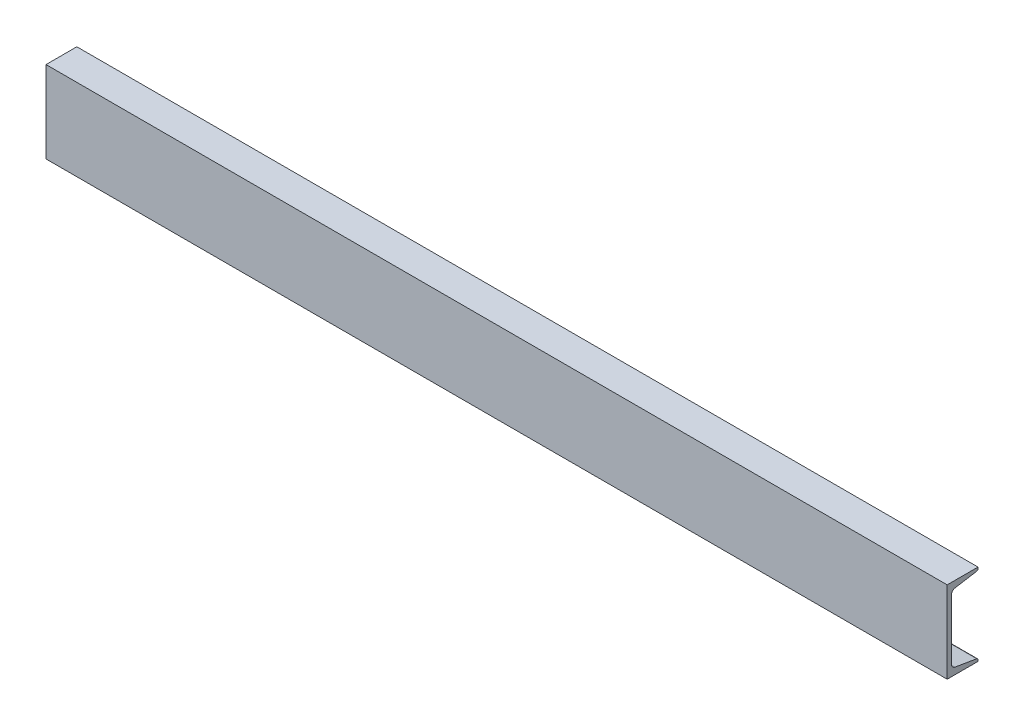
ISO-10303-21;
HEADER;
FILE_DESCRIPTION(('STEP AP214'),'2;1');
FILE_NAME('part.step','',(''),(''),'','','');
FILE_SCHEMA(('AUTOMOTIVE_DESIGN { 1 0 10303 214 1 1 1 1 }'));
ENDSEC;
DATA;
#1=APPLICATION_CONTEXT('core data for automotive mechanical design processes');
#2=APPLICATION_PROTOCOL_DEFINITION('international standard','automotive_design',2000,#1);
#3=PRODUCT_CONTEXT('',#1,'mechanical');
#4=PRODUCT('Part','Part','',(#3));
#5=PRODUCT_RELATED_PRODUCT_CATEGORY('part','',(#4));
#6=PRODUCT_DEFINITION_FORMATION('','',#4);
#7=PRODUCT_DEFINITION_CONTEXT('part definition',#1,'design');
#8=PRODUCT_DEFINITION('design','',#6,#7);
#9=PRODUCT_DEFINITION_SHAPE('','',#8);
#10=(LENGTH_UNIT() NAMED_UNIT(*) SI_UNIT(.MILLI.,.METRE.));
#11=(NAMED_UNIT(*) PLANE_ANGLE_UNIT() SI_UNIT($,.RADIAN.));
#12=(NAMED_UNIT(*) SI_UNIT($,.STERADIAN.) SOLID_ANGLE_UNIT());
#13=UNCERTAINTY_MEASURE_WITH_UNIT(LENGTH_MEASURE(1.E-05),#10,'distance_accuracy_value','');
#14=(GEOMETRIC_REPRESENTATION_CONTEXT(3) GLOBAL_UNCERTAINTY_ASSIGNED_CONTEXT((#13)) GLOBAL_UNIT_ASSIGNED_CONTEXT((#10,
#11,#12)) REPRESENTATION_CONTEXT('',''));
#15=CARTESIAN_POINT('',(0.,0.,0.));
#16=DIRECTION('',(0.,0.,1.));
#17=DIRECTION('',(1.,0.,0.));
#18=AXIS2_PLACEMENT_3D('',#15,#16,#17);
#19=CARTESIAN_POINT('',(1400.00000000001,-63.4999999999621,3.5527136788005E-12));
#20=DIRECTION('',(0.,1.,0.));
#21=DIRECTION('',(0.,0.,1.));
#22=AXIS2_PLACEMENT_3D('',#19,#20,#21);
#23=PLANE('',#22);
#24=DIRECTION('',(0.,0.,-1.));
#25=VECTOR('',#24,1.);
#26=CARTESIAN_POINT('',(0.,-63.5000000000048,0.));
#27=LINE('',#26,#25);
#28=CARTESIAN_POINT('',(0.,-63.5000000000048,0.));
#29=VERTEX_POINT('',#28);
#30=CARTESIAN_POINT('',(0.,-63.5000000000048,-47.8999999999985));
#31=VERTEX_POINT('',#30);
#32=EDGE_CURVE('E194',#29,#31,#27,.T.);
#33=ORIENTED_EDGE('',*,*,#32,.T.);
#34=DIRECTION('',(-1.,0.,0.));
#35=VECTOR('',#34,1.);
#36=CARTESIAN_POINT('',(1400.00000000001,-63.4999999999621,-47.8999999999985));
#37=LINE('',#36,#35);
#38=CARTESIAN_POINT('',(1400.00000000001,-63.4999999999621,-47.8999999999985));
#39=VERTEX_POINT('',#38);
#40=EDGE_CURVE('E13',#39,#31,#37,.T.);
#41=ORIENTED_EDGE('',*,*,#40,.F.);
#42=DIRECTION('',(0.,0.,-1.));
#43=VECTOR('',#42,1.);
#44=CARTESIAN_POINT('',(1400.00000000001,-63.4999999999621,3.5527136788005E-12));
#45=LINE('',#44,#43);
#46=CARTESIAN_POINT('',(1400.00000000001,-63.4999999999621,3.5527136788005E-12));
#47=VERTEX_POINT('',#46);
#48=EDGE_CURVE('E216',#47,#39,#45,.T.);
#49=ORIENTED_EDGE('',*,*,#48,.F.);
#50=DIRECTION('',(-1.,0.,0.));
#51=VECTOR('',#50,1.);
#52=CARTESIAN_POINT('',(1400.00000000001,-63.4999999999621,3.5527136788005E-12));
#53=LINE('',#52,#51);
#54=EDGE_CURVE('E190',#47,#29,#53,.T.);
#55=ORIENTED_EDGE('',*,*,#54,.T.);
#56=EDGE_LOOP('',(#33,#41,#49,#55));
#57=FACE_BOUND('',#56,.T.);
#58=ADVANCED_FACE('F74',(#57),#23,.F.);
#59=CARTESIAN_POINT('',(1400.00000000001,-63.4999999999621,-47.8999999999985));
#60=DIRECTION('',(0.,0.,1.));
#61=DIRECTION('',(1.,0.,0.));
#62=AXIS2_PLACEMENT_3D('',#59,#60,#61);
#63=PLANE('',#62);
#64=DIRECTION('',(0.,1.,0.));
#65=VECTOR('',#64,1.);
#66=CARTESIAN_POINT('',(0.,-63.5000000000048,-47.8999999999985));
#67=LINE('',#66,#65);
#68=CARTESIAN_POINT('',(0.,-61.3423351358335,-47.8999999999985));
#69=VERTEX_POINT('',#68);
#70=EDGE_CURVE('E197',#31,#69,#67,.T.);
#71=ORIENTED_EDGE('',*,*,#70,.T.);
#72=DIRECTION('',(-1.,0.,0.));
#73=VECTOR('',#72,1.);
#74=CARTESIAN_POINT('',(1400.00000000001,-61.3423351357909,-47.8999999999985));
#75=LINE('',#74,#73);
#76=CARTESIAN_POINT('',(1400.00000000001,-61.3423351357909,-47.8999999999985));
#77=VERTEX_POINT('',#76);
#78=EDGE_CURVE('E82',#77,#69,#75,.T.);
#79=ORIENTED_EDGE('',*,*,#78,.F.);
#80=DIRECTION('',(0.,1.,0.));
#81=VECTOR('',#80,1.);
#82=CARTESIAN_POINT('',(1400.00000000001,-63.4999999999621,-47.8999999999985));
#83=LINE('',#82,#81);
#84=EDGE_CURVE('E145',#39,#77,#83,.T.);
#85=ORIENTED_EDGE('',*,*,#84,.F.);
#86=ORIENTED_EDGE('',*,*,#40,.T.);
#87=EDGE_LOOP('',(#71,#79,#85,#86));
#88=FACE_BOUND('',#87,.T.);
#89=ADVANCED_FACE('F294',(#88),#63,.F.);
#90=CARTESIAN_POINT('',(1400.00000000001,-61.3423351357909,-45.3599999999952));
#91=DIRECTION('',(-1.,0.,0.));
#92=DIRECTION('',(0.,0.,1.));
#93=AXIS2_PLACEMENT_3D('',#90,#91,#92);
#94=CYLINDRICAL_SURFACE('',#93,2.54000000000001);
#95=CARTESIAN_POINT('',(0.,-61.3423351358335,-45.3599999999987));
#96=DIRECTION('',(1.,0.,0.));
#97=DIRECTION('',(0.,0.,-1.));
#98=AXIS2_PLACEMENT_3D('',#95,#96,#97);
#99=CIRCLE('',#98,2.54000000000001);
#100=CARTESIAN_POINT('',(0.,-58.8368995092452,-45.777603066341));
#101=VERTEX_POINT('',#100);
#102=EDGE_CURVE('E199',#69,#101,#99,.T.);
#103=ORIENTED_EDGE('',*,*,#102,.T.);
#104=DIRECTION('',(-1.,0.,0.));
#105=VECTOR('',#104,1.);
#106=CARTESIAN_POINT('',(1400.00000000001,-58.8368995092026,-45.7776030663375));
#107=LINE('',#106,#105);
#108=CARTESIAN_POINT('',(1400.00000000001,-58.8368995092026,-45.7776030663375));
#109=VERTEX_POINT('',#108);
#110=EDGE_CURVE('E235',#109,#101,#107,.T.);
#111=ORIENTED_EDGE('',*,*,#110,.F.);
#112=CARTESIAN_POINT('',(1400.00000000001,-61.3423351357909,-45.3599999999952));
#113=DIRECTION('',(1.,0.,0.));
#114=DIRECTION('',(0.,0.,-1.));
#115=AXIS2_PLACEMENT_3D('',#112,#113,#114);
#116=CIRCLE('',#115,2.54000000000001);
#117=EDGE_CURVE('E243',#77,#109,#116,.T.);
#118=ORIENTED_EDGE('',*,*,#117,.F.);
#119=ORIENTED_EDGE('',*,*,#78,.T.);
#120=EDGE_LOOP('',(#103,#111,#118,#119));
#121=FACE_BOUND('',#120,.T.);
#122=ADVANCED_FACE('F241',(#121),#94,.T.);
#123=CARTESIAN_POINT('',(1400.00000000001,-53.2541703880867,-12.2836717208763));
#124=DIRECTION('',(0.,-0.986391978972162,0.16441065603963));
#125=DIRECTION('',(0.,-0.16441065603963,-0.986391978972162));
#126=AXIS2_PLACEMENT_3D('',#123,#124,#125);
#127=PLANE('',#126);
#128=DIRECTION('',(0.,0.16441065603963,0.986391978972162));
#129=VECTOR('',#128,1.);
#130=CARTESIAN_POINT('',(0.,-53.2541703881293,-12.2836717208799));
#131=LINE('',#130,#129);
#132=CARTESIAN_POINT('',(0.,-53.2541703881293,-12.2836717208799));
#133=VERTEX_POINT('',#132);
#134=EDGE_CURVE('E201',#101,#133,#131,.T.);
#135=ORIENTED_EDGE('',*,*,#134,.T.);
#136=DIRECTION('',(-1.,0.,0.));
#137=VECTOR('',#136,1.);
#138=CARTESIAN_POINT('',(1400.00000000001,-53.2541703880867,-12.2836717208763));
#139=LINE('',#138,#137);
#140=CARTESIAN_POINT('',(1400.00000000001,-53.2541703880867,-12.2836717208763));
#141=VERTEX_POINT('',#140);
#142=EDGE_CURVE('E232',#141,#133,#139,.T.);
#143=ORIENTED_EDGE('',*,*,#142,.F.);
#144=DIRECTION('',(0.,0.16441065603963,0.986391978972162));
#145=VECTOR('',#144,1.);
#146=CARTESIAN_POINT('',(1400.00000000001,-53.2541703880867,-12.2836717208763));
#147=LINE('',#146,#145);
#148=EDGE_CURVE('E261',#109,#141,#147,.T.);
#149=ORIENTED_EDGE('',*,*,#148,.F.);
#150=ORIENTED_EDGE('',*,*,#110,.T.);
#151=EDGE_LOOP('',(#135,#143,#149,#150));
#152=FACE_BOUND('',#151,.T.);
#153=ADVANCED_FACE('F252',(#152),#127,.F.);
#154=CARTESIAN_POINT('',(1400.00000000001,-46.4894941962939,-13.4111999999966));
#155=DIRECTION('',(-1.,0.,0.));
#156=DIRECTION('',(0.,0.,1.));
#157=AXIS2_PLACEMENT_3D('',#154,#155,#156);
#158=CYLINDRICAL_SURFACE('',#157,6.85800000000002);
#159=CARTESIAN_POINT('',(0.,-46.4894941963365,-13.4112000000002));
#160=DIRECTION('',(-1.,0.,0.));
#161=DIRECTION('',(0.,0.,-1.));
#162=AXIS2_PLACEMENT_3D('',#159,#160,#161);
#163=CIRCLE('',#162,6.85800000000002);
#164=CARTESIAN_POINT('',(0.,-46.4894941963365,-6.55319999999904));
#165=VERTEX_POINT('',#164);
#166=EDGE_CURVE('E203',#133,#165,#163,.T.);
#167=ORIENTED_EDGE('',*,*,#166,.T.);
#168=DIRECTION('',(-1.,0.,0.));
#169=VECTOR('',#168,1.);
#170=CARTESIAN_POINT('',(1400.00000000001,-46.4894941962939,-6.55319999999548));
#171=LINE('',#170,#169);
#172=CARTESIAN_POINT('',(1400.00000000001,-46.4894941962939,-6.55319999999548));
#173=VERTEX_POINT('',#172);
#174=EDGE_CURVE('E229',#173,#165,#171,.T.);
#175=ORIENTED_EDGE('',*,*,#174,.F.);
#176=CARTESIAN_POINT('',(1400.00000000001,-46.4894941962939,-13.4111999999966));
#177=DIRECTION('',(-1.,0.,0.));
#178=DIRECTION('',(0.,0.,-1.));
#179=AXIS2_PLACEMENT_3D('',#176,#177,#178);
#180=CIRCLE('',#179,6.85800000000002);
#181=EDGE_CURVE('E258',#141,#173,#180,.T.);
#182=ORIENTED_EDGE('',*,*,#181,.F.);
#183=ORIENTED_EDGE('',*,*,#142,.T.);
#184=EDGE_LOOP('',(#167,#175,#182,#183));
#185=FACE_BOUND('',#184,.T.);
#186=ADVANCED_FACE('F256',(#185),#158,.F.);
#187=CARTESIAN_POINT('',(1400.00000000001,46.4894941963649,-6.55319999999548));
#188=DIRECTION('',(0.,0.,1.));
#189=DIRECTION('',(1.,0.,0.));
#190=AXIS2_PLACEMENT_3D('',#187,#188,#189);
#191=PLANE('',#190);
#192=DIRECTION('',(0.,1.,0.));
#193=VECTOR('',#192,1.);
#194=CARTESIAN_POINT('',(0.,46.4894941963365,-6.55319999999548));
#195=LINE('',#194,#193);
#196=CARTESIAN_POINT('',(0.,46.4894941963365,-6.55319999999548));
#197=VERTEX_POINT('',#196);
#198=EDGE_CURVE('E205',#165,#197,#195,.T.);
#199=ORIENTED_EDGE('',*,*,#198,.T.);
#200=DIRECTION('',(-1.,0.,0.));
#201=VECTOR('',#200,1.);
#202=CARTESIAN_POINT('',(1400.00000000001,46.4894941963649,-6.55319999999548));
#203=LINE('',#202,#201);
#204=CARTESIAN_POINT('',(1400.00000000001,46.4894941963649,-6.55319999999548));
#205=VERTEX_POINT('',#204);
#206=EDGE_CURVE('E226',#205,#197,#203,.T.);
#207=ORIENTED_EDGE('',*,*,#206,.F.);
#208=DIRECTION('',(0.,1.,0.));
#209=VECTOR('',#208,1.);
#210=CARTESIAN_POINT('',(1400.00000000001,46.4894941963649,-6.55319999999548));
#211=LINE('',#210,#209);
#212=EDGE_CURVE('E260',#173,#205,#211,.T.);
#213=ORIENTED_EDGE('',*,*,#212,.F.);
#214=ORIENTED_EDGE('',*,*,#174,.T.);
#215=EDGE_LOOP('',(#199,#207,#213,#214));
#216=FACE_BOUND('',#215,.T.);
#217=ADVANCED_FACE('F307',(#216),#191,.F.);
#218=CARTESIAN_POINT('',(1400.00000000001,46.4894941963649,-13.4111999999966));
#219=DIRECTION('',(-1.,0.,0.));
#220=DIRECTION('',(0.,0.,1.));
#221=AXIS2_PLACEMENT_3D('',#218,#219,#220);
#222=CYLINDRICAL_SURFACE('',#221,6.85800000000002);
#223=CARTESIAN_POINT('',(0.,46.4894941963365,-13.4111999999966));
#224=DIRECTION('',(-1.,0.,0.));
#225=DIRECTION('',(0.,0.,1.));
#226=AXIS2_PLACEMENT_3D('',#223,#224,#225);
#227=CIRCLE('',#226,6.85800000000002);
#228=CARTESIAN_POINT('',(0.,53.2541703881151,-12.2836717208763));
#229=VERTEX_POINT('',#228);
#230=EDGE_CURVE('E207',#197,#229,#227,.T.);
#231=ORIENTED_EDGE('',*,*,#230,.T.);
#232=DIRECTION('',(-1.,0.,0.));
#233=VECTOR('',#232,1.);
#234=CARTESIAN_POINT('',(1400.00000000001,53.2541703881577,-12.2836717208763));
#235=LINE('',#234,#233);
#236=CARTESIAN_POINT('',(1400.00000000001,53.2541703881577,-12.2836717208763));
#237=VERTEX_POINT('',#236);
#238=EDGE_CURVE('E223',#237,#229,#235,.T.);
#239=ORIENTED_EDGE('',*,*,#238,.F.);
#240=CARTESIAN_POINT('',(1400.00000000001,46.4894941963649,-13.4111999999966));
#241=DIRECTION('',(-1.,0.,0.));
#242=DIRECTION('',(0.,0.,1.));
#243=AXIS2_PLACEMENT_3D('',#240,#241,#242);
#244=CIRCLE('',#243,6.85800000000002);
#245=EDGE_CURVE('E263',#205,#237,#244,.T.);
#246=ORIENTED_EDGE('',*,*,#245,.F.);
#247=ORIENTED_EDGE('',*,*,#206,.T.);
#248=EDGE_LOOP('',(#231,#239,#246,#247));
#249=FACE_BOUND('',#248,.T.);
#250=ADVANCED_FACE('F310',(#249),#222,.F.);
#251=CARTESIAN_POINT('',(1400.00000000001,53.2541703881577,-12.2836717208763));
#252=DIRECTION('',(0.,0.986391978972162,0.16441065603963));
#253=DIRECTION('',(0.,-0.16441065603963,0.986391978972162));
#254=AXIS2_PLACEMENT_3D('',#251,#252,#253);
#255=PLANE('',#254);
#256=DIRECTION('',(0.,0.16441065603963,-0.986391978972162));
#257=VECTOR('',#256,1.);
#258=CARTESIAN_POINT('',(0.,53.2541703881151,-12.2836717208763));
#259=LINE('',#258,#257);
#260=CARTESIAN_POINT('',(0.,58.8368995092452,-45.7776030663375));
#261=VERTEX_POINT('',#260);
#262=EDGE_CURVE('E209',#229,#261,#259,.T.);
#263=ORIENTED_EDGE('',*,*,#262,.T.);
#264=DIRECTION('',(-1.,0.,0.));
#265=VECTOR('',#264,1.);
#266=CARTESIAN_POINT('',(1400.00000000001,58.8368995092878,-45.7776030663375));
#267=LINE('',#266,#265);
#268=CARTESIAN_POINT('',(1400.00000000001,58.8368995092878,-45.7776030663375));
#269=VERTEX_POINT('',#268);
#270=EDGE_CURVE('E220',#269,#261,#267,.T.);
#271=ORIENTED_EDGE('',*,*,#270,.F.);
#272=DIRECTION('',(0.,0.16441065603963,-0.986391978972162));
#273=VECTOR('',#272,1.);
#274=CARTESIAN_POINT('',(1400.00000000001,53.2541703881577,-12.2836717208763));
#275=LINE('',#274,#273);
#276=EDGE_CURVE('E269',#237,#269,#275,.T.);
#277=ORIENTED_EDGE('',*,*,#276,.F.);
#278=ORIENTED_EDGE('',*,*,#238,.T.);
#279=EDGE_LOOP('',(#263,#271,#277,#278));
#280=FACE_BOUND('',#279,.T.);
#281=ADVANCED_FACE('F275',(#280),#255,.F.);
#282=CARTESIAN_POINT('',(1400.00000000001,61.3423351358762,-45.3599999999987));
#283=DIRECTION('',(-1.,0.,0.));
#284=DIRECTION('',(0.,0.,1.));
#285=AXIS2_PLACEMENT_3D('',#282,#283,#284);
#286=CYLINDRICAL_SURFACE('',#285,2.54000000000001);
#287=CARTESIAN_POINT('',(0.,61.3423351358335,-45.3599999999952));
#288=DIRECTION('',(1.,0.,0.));
#289=DIRECTION('',(0.,0.,1.));
#290=AXIS2_PLACEMENT_3D('',#287,#288,#289);
#291=CIRCLE('',#290,2.54000000000001);
#292=CARTESIAN_POINT('',(0.,61.3423351358335,-47.8999999999949));
#293=VERTEX_POINT('',#292);
#294=EDGE_CURVE('E211',#261,#293,#291,.T.);
#295=ORIENTED_EDGE('',*,*,#294,.T.);
#296=DIRECTION('',(-1.,0.,0.));
#297=VECTOR('',#296,1.);
#298=CARTESIAN_POINT('',(1400.00000000001,61.3423351358762,-47.8999999999985));
#299=LINE('',#298,#297);
#300=CARTESIAN_POINT('',(1400.00000000001,61.3423351358762,-47.8999999999985));
#301=VERTEX_POINT('',#300);
#302=EDGE_CURVE('E185',#301,#293,#299,.T.);
#303=ORIENTED_EDGE('',*,*,#302,.F.);
#304=CARTESIAN_POINT('',(1400.00000000001,61.3423351358762,-45.3599999999987));
#305=DIRECTION('',(1.,0.,0.));
#306=DIRECTION('',(0.,0.,1.));
#307=AXIS2_PLACEMENT_3D('',#304,#305,#306);
#308=CIRCLE('',#307,2.54000000000001);
#309=EDGE_CURVE('E176',#269,#301,#308,.T.);
#310=ORIENTED_EDGE('',*,*,#309,.F.);
#311=ORIENTED_EDGE('',*,*,#270,.T.);
#312=EDGE_LOOP('',(#295,#303,#310,#311));
#313=FACE_BOUND('',#312,.T.);
#314=ADVANCED_FACE('F279',(#313),#286,.T.);
#315=CARTESIAN_POINT('',(1400.00000000001,63.5000000000474,-47.8999999999985));
#316=DIRECTION('',(0.,0.,1.));
#317=DIRECTION('',(1.,0.,0.));
#318=AXIS2_PLACEMENT_3D('',#315,#316,#317);
#319=PLANE('',#318);
#320=DIRECTION('',(0.,1.,0.));
#321=VECTOR('',#320,1.);
#322=CARTESIAN_POINT('',(0.,63.5000000000048,-47.8999999999949));
#323=LINE('',#322,#321);
#324=CARTESIAN_POINT('',(0.,63.5000000000048,-47.8999999999949));
#325=VERTEX_POINT('',#324);
#326=EDGE_CURVE('E184',#293,#325,#323,.T.);
#327=ORIENTED_EDGE('',*,*,#326,.T.);
#328=DIRECTION('',(-1.,0.,0.));
#329=VECTOR('',#328,1.);
#330=CARTESIAN_POINT('',(1400.00000000001,63.5000000000474,-47.8999999999985));
#331=LINE('',#330,#329);
#332=CARTESIAN_POINT('',(1400.00000000001,63.5000000000474,-47.8999999999985));
#333=VERTEX_POINT('',#332);
#334=EDGE_CURVE('E181',#333,#325,#331,.T.);
#335=ORIENTED_EDGE('',*,*,#334,.F.);
#336=DIRECTION('',(0.,1.,0.));
#337=VECTOR('',#336,1.);
#338=CARTESIAN_POINT('',(1400.00000000001,63.5000000000474,-47.8999999999985));
#339=LINE('',#338,#337);
#340=EDGE_CURVE('E170',#301,#333,#339,.T.);
#341=ORIENTED_EDGE('',*,*,#340,.F.);
#342=ORIENTED_EDGE('',*,*,#302,.T.);
#343=EDGE_LOOP('',(#327,#335,#341,#342));
#344=FACE_BOUND('',#343,.T.);
#345=ADVANCED_FACE('F182',(#344),#319,.F.);
#346=CARTESIAN_POINT('',(1400.00000000001,63.5000000000474,3.5527136788005E-12));
#347=DIRECTION('',(0.,-1.,0.));
#348=DIRECTION('',(0.,0.,-1.));
#349=AXIS2_PLACEMENT_3D('',#346,#347,#348);
#350=PLANE('',#349);
#351=DIRECTION('',(0.,0.,1.));
#352=VECTOR('',#351,1.);
#353=CARTESIAN_POINT('',(0.,63.5000000000048,3.5527136788005E-12));
#354=LINE('',#353,#352);
#355=CARTESIAN_POINT('',(0.,63.5000000000048,3.5527136788005E-12));
#356=VERTEX_POINT('',#355);
#357=EDGE_CURVE('E131',#325,#356,#354,.T.);
#358=ORIENTED_EDGE('',*,*,#357,.T.);
#359=DIRECTION('',(-1.,0.,0.));
#360=VECTOR('',#359,1.);
#361=CARTESIAN_POINT('',(1400.00000000001,63.5000000000474,3.5527136788005E-12));
#362=LINE('',#361,#360);
#363=CARTESIAN_POINT('',(1400.00000000001,63.5000000000474,3.5527136788005E-12));
#364=VERTEX_POINT('',#363);
#365=EDGE_CURVE('E186',#364,#356,#362,.T.);
#366=ORIENTED_EDGE('',*,*,#365,.F.);
#367=DIRECTION('',(0.,0.,1.));
#368=VECTOR('',#367,1.);
#369=CARTESIAN_POINT('',(1400.00000000001,63.5000000000474,3.5527136788005E-12));
#370=LINE('',#369,#368);
#371=EDGE_CURVE('E174',#333,#364,#370,.T.);
#372=ORIENTED_EDGE('',*,*,#371,.F.);
#373=ORIENTED_EDGE('',*,*,#334,.T.);
#374=EDGE_LOOP('',(#358,#366,#372,#373));
#375=FACE_BOUND('',#374,.T.);
#376=ADVANCED_FACE('F188',(#375),#350,.F.);
#377=CARTESIAN_POINT('',(1400.00000000001,-63.4999999999621,3.5527136788005E-12));
#378=DIRECTION('',(0.,0.,-1.));
#379=DIRECTION('',(-1.,0.,0.));
#380=AXIS2_PLACEMENT_3D('',#377,#378,#379);
#381=PLANE('',#380);
#382=DIRECTION('',(0.,-1.,0.));
#383=VECTOR('',#382,1.);
#384=CARTESIAN_POINT('',(0.,-63.5000000000048,0.));
#385=LINE('',#384,#383);
#386=EDGE_CURVE('E137',#356,#29,#385,.T.);
#387=ORIENTED_EDGE('',*,*,#386,.T.);
#388=ORIENTED_EDGE('',*,*,#54,.F.);
#389=DIRECTION('',(0.,-1.,0.));
#390=VECTOR('',#389,1.);
#391=CARTESIAN_POINT('',(1400.00000000001,-63.4999999999621,3.5527136788005E-12));
#392=LINE('',#391,#390);
#393=EDGE_CURVE('E90',#364,#47,#392,.T.);
#394=ORIENTED_EDGE('',*,*,#393,.F.);
#395=ORIENTED_EDGE('',*,*,#365,.T.);
#396=EDGE_LOOP('',(#387,#388,#394,#395));
#397=FACE_BOUND('',#396,.T.);
#398=ADVANCED_FACE('F283',(#397),#381,.F.);
#399=CARTESIAN_POINT('',(1400.00000000001,-61.3423351357909,-45.3599999999952));
#400=DIRECTION('',(1.,0.,0.));
#401=DIRECTION('',(0.,0.,-1.));
#402=AXIS2_PLACEMENT_3D('',#399,#400,#401);
#403=PLANE('',#402);
#404=ORIENTED_EDGE('',*,*,#48,.T.);
#405=ORIENTED_EDGE('',*,*,#84,.T.);
#406=ORIENTED_EDGE('',*,*,#117,.T.);
#407=ORIENTED_EDGE('',*,*,#148,.T.);
#408=ORIENTED_EDGE('',*,*,#181,.T.);
#409=ORIENTED_EDGE('',*,*,#212,.T.);
#410=ORIENTED_EDGE('',*,*,#245,.T.);
#411=ORIENTED_EDGE('',*,*,#276,.T.);
#412=ORIENTED_EDGE('',*,*,#309,.T.);
#413=ORIENTED_EDGE('',*,*,#340,.T.);
#414=ORIENTED_EDGE('',*,*,#371,.T.);
#415=ORIENTED_EDGE('',*,*,#393,.T.);
#416=EDGE_LOOP('',(#404,#405,#406,#407,#408,#409,#410,#411,#412,#413,#414,#415));
#417=FACE_BOUND('',#416,.T.);
#418=ADVANCED_FACE('F172',(#417),#403,.T.);
#419=CARTESIAN_POINT('',(0.,-61.3423351358335,-45.3599999999987));
#420=DIRECTION('',(1.,0.,0.));
#421=DIRECTION('',(0.,0.,-1.));
#422=AXIS2_PLACEMENT_3D('',#419,#420,#421);
#423=PLANE('',#422);
#424=ORIENTED_EDGE('',*,*,#32,.F.);
#425=ORIENTED_EDGE('',*,*,#386,.F.);
#426=ORIENTED_EDGE('',*,*,#357,.F.);
#427=ORIENTED_EDGE('',*,*,#326,.F.);
#428=ORIENTED_EDGE('',*,*,#294,.F.);
#429=ORIENTED_EDGE('',*,*,#262,.F.);
#430=ORIENTED_EDGE('',*,*,#230,.F.);
#431=ORIENTED_EDGE('',*,*,#198,.F.);
#432=ORIENTED_EDGE('',*,*,#166,.F.);
#433=ORIENTED_EDGE('',*,*,#134,.F.);
#434=ORIENTED_EDGE('',*,*,#102,.F.);
#435=ORIENTED_EDGE('',*,*,#70,.F.);
#436=EDGE_LOOP('',(#424,#425,#426,#427,#428,#429,#430,#431,#432,#433,#434,#435));
#437=FACE_BOUND('',#436,.T.);
#438=ADVANCED_FACE('F247',(#437),#423,.F.);
#439=CLOSED_SHELL('',(#58,#89,#122,#153,#186,#217,#250,#281,#314,#345,#376,#398,#418,#438));
#440=MANIFOLD_SOLID_BREP('B2',#439);
#441=ADVANCED_BREP_SHAPE_REPRESENTATION('',(#18,#440),#14);
#442=SHAPE_DEFINITION_REPRESENTATION(#9,#441);
ENDSEC;
END-ISO-10303-21;
